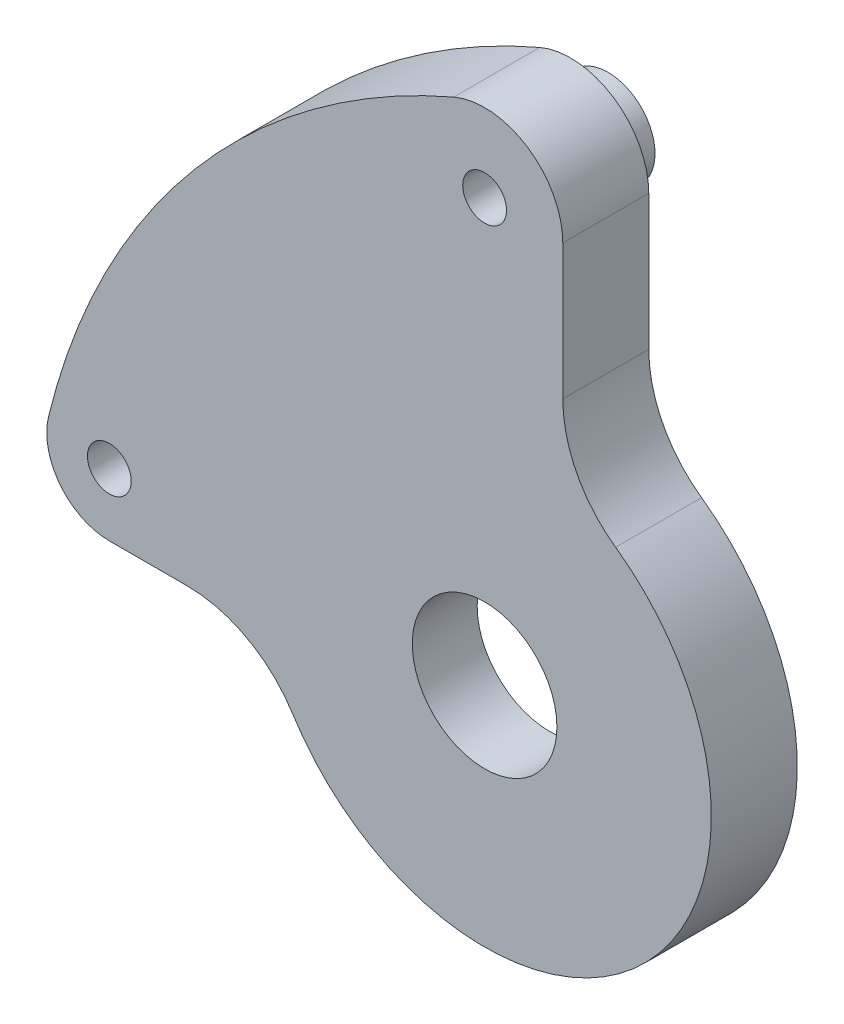
ISO-10303-21;
HEADER;
FILE_DESCRIPTION(('STEP AP214'),'2;1');
FILE_NAME('part.step','',(''),(''),'','','');
FILE_SCHEMA(('AUTOMOTIVE_DESIGN { 1 0 10303 214 1 1 1 1 }'));
ENDSEC;
DATA;
#1=APPLICATION_CONTEXT('core data for automotive mechanical design processes');
#2=APPLICATION_PROTOCOL_DEFINITION('international standard','automotive_design',2000,#1);
#3=PRODUCT_CONTEXT('',#1,'mechanical');
#4=PRODUCT('Part','Part','',(#3));
#5=PRODUCT_RELATED_PRODUCT_CATEGORY('part','',(#4));
#6=PRODUCT_DEFINITION_FORMATION('','',#4);
#7=PRODUCT_DEFINITION_CONTEXT('part definition',#1,'design');
#8=PRODUCT_DEFINITION('design','',#6,#7);
#9=PRODUCT_DEFINITION_SHAPE('','',#8);
#10=(LENGTH_UNIT() NAMED_UNIT(*) SI_UNIT(.MILLI.,.METRE.));
#11=(NAMED_UNIT(*) PLANE_ANGLE_UNIT() SI_UNIT($,.RADIAN.));
#12=(NAMED_UNIT(*) SI_UNIT($,.STERADIAN.) SOLID_ANGLE_UNIT());
#13=UNCERTAINTY_MEASURE_WITH_UNIT(LENGTH_MEASURE(1.E-05),#10,'distance_accuracy_value','');
#14=(GEOMETRIC_REPRESENTATION_CONTEXT(3) GLOBAL_UNCERTAINTY_ASSIGNED_CONTEXT((#13)) GLOBAL_UNIT_ASSIGNED_CONTEXT((#10,
#11,#12)) REPRESENTATION_CONTEXT('',''));
#15=CARTESIAN_POINT('',(0.,0.,0.));
#16=DIRECTION('',(0.,0.,1.));
#17=DIRECTION('',(1.,0.,0.));
#18=AXIS2_PLACEMENT_3D('',#15,#16,#17);
#19=CARTESIAN_POINT('',(0.,0.,-2.55));
#20=DIRECTION('',(0.,0.,1.));
#21=DIRECTION('',(-1.,0.,0.));
#22=AXIS2_PLACEMENT_3D('',#19,#20,#21);
#23=PLANE('',#22);
#24=CARTESIAN_POINT('',(0.,0.,-2.55));
#25=DIRECTION('',(0.,0.,1.));
#26=DIRECTION('',(-1.,0.,0.));
#27=AXIS2_PLACEMENT_3D('',#24,#25,#26);
#28=CIRCLE('',#27,12.2);
#29=CARTESIAN_POINT('',(-12.2,0.,-2.55));
#30=VERTEX_POINT('',#29);
#31=EDGE_CURVE('E195',#30,#30,#28,.T.);
#32=ORIENTED_EDGE('',*,*,#31,.F.);
#33=EDGE_LOOP('',(#32));
#34=FACE_BOUND('',#33,.T.);
#35=CARTESIAN_POINT('',(0.,0.,-2.55));
#36=DIRECTION('',(0.,0.,-1.));
#37=DIRECTION('',(-1.,0.,0.));
#38=AXIS2_PLACEMENT_3D('',#35,#36,#37);
#39=CIRCLE('',#38,6.375);
#40=CARTESIAN_POINT('',(-6.375,0.,-2.55));
#41=VERTEX_POINT('',#40);
#42=EDGE_CURVE('E11',#41,#41,#39,.F.);
#43=ORIENTED_EDGE('',*,*,#42,.T.);
#44=EDGE_LOOP('',(#43));
#45=FACE_BOUND('',#44,.T.);
#46=ADVANCED_FACE('F35',(#34,#45),#23,.F.);
#47=CARTESIAN_POINT('',(0.,0.,-5.5));
#48=DIRECTION('',(0.,0.,-1.));
#49=DIRECTION('',(1.,0.,0.));
#50=AXIS2_PLACEMENT_3D('',#47,#48,#49);
#51=PLANE('',#50);
#52=CARTESIAN_POINT('',(0.,0.,-5.5));
#53=DIRECTION('',(0.,0.,1.));
#54=DIRECTION('',(1.,0.,0.));
#55=AXIS2_PLACEMENT_3D('',#52,#53,#54);
#56=CIRCLE('',#55,14.5);
#57=CARTESIAN_POINT('',(-12.2656249557679,-7.73333333333334,-5.5));
#58=VERTEX_POINT('',#57);
#59=CARTESIAN_POINT('',(8.3777777777777,11.834814722089,-5.5));
#60=VERTEX_POINT('',#59);
#61=EDGE_CURVE('E143',#58,#60,#56,.T.);
#62=ORIENTED_EDGE('',*,*,#61,.F.);
#63=CARTESIAN_POINT('',(-19.0328663106743,-12.,-5.5));
#64=DIRECTION('',(0.,0.,-1.));
#65=DIRECTION('',(-1.,0.,0.));
#66=AXIS2_PLACEMENT_3D('',#63,#64,#65);
#67=CIRCLE('',#66,8.00000000000001);
#68=CARTESIAN_POINT('',(-19.0328663106743,-4.,-5.5));
#69=VERTEX_POINT('',#68);
#70=EDGE_CURVE('E161',#69,#58,#67,.T.);
#71=ORIENTED_EDGE('',*,*,#70,.F.);
#72=DIRECTION('',(1.,0.,0.));
#73=VECTOR('',#72,1.);
#74=CARTESIAN_POINT('',(-24.,-4.,-5.5));
#75=LINE('',#74,#73);
#76=CARTESIAN_POINT('',(-24.,-4.,-5.5));
#77=VERTEX_POINT('',#76);
#78=EDGE_CURVE('E159',#77,#69,#75,.T.);
#79=ORIENTED_EDGE('',*,*,#78,.F.);
#80=CARTESIAN_POINT('',(-24.,0.,-5.5));
#81=DIRECTION('',(0.,0.,1.));
#82=DIRECTION('',(1.,0.,0.));
#83=AXIS2_PLACEMENT_3D('',#80,#81,#82);
#84=CIRCLE('',#83,4.);
#85=CARTESIAN_POINT('',(-27.885598891218,0.949800640432248,-5.5));
#86=VERTEX_POINT('',#85);
#87=EDGE_CURVE('E130',#86,#77,#84,.T.);
#88=ORIENTED_EDGE('',*,*,#87,.F.);
#89=CARTESIAN_POINT('',(15.8273886349844,-9.73545656443054,-5.5));
#90=DIRECTION('',(0.,0.,1.));
#91=DIRECTION('',(1.,0.,0.));
#92=AXIS2_PLACEMENT_3D('',#89,#90,#91);
#93=CIRCLE('',#92,45.);
#94=CARTESIAN_POINT('',(-1.97842357937317,31.5919320705538,-5.5));
#95=VERTEX_POINT('',#94);
#96=EDGE_CURVE('E155',#95,#86,#93,.T.);
#97=ORIENTED_EDGE('',*,*,#96,.F.);
#98=CARTESIAN_POINT('',(-1.0088308886416E-13,27.,-5.5));
#99=DIRECTION('',(0.,0.,1.));
#100=DIRECTION('',(1.,0.,0.));
#101=AXIS2_PLACEMENT_3D('',#98,#99,#100);
#102=CIRCLE('',#101,4.99999999999999);
#103=CARTESIAN_POINT('',(4.9999999999999,27.,-5.5));
#104=VERTEX_POINT('',#103);
#105=EDGE_CURVE('E152',#104,#95,#102,.T.);
#106=ORIENTED_EDGE('',*,*,#105,.F.);
#107=DIRECTION('',(0.,1.,0.));
#108=VECTOR('',#107,1.);
#109=CARTESIAN_POINT('',(4.9999999999999,18.364367672207,-5.5));
#110=LINE('',#109,#108);
#111=CARTESIAN_POINT('',(4.99999999999991,18.364367672207,-5.5));
#112=VERTEX_POINT('',#111);
#113=EDGE_CURVE('E149',#112,#104,#110,.T.);
#114=ORIENTED_EDGE('',*,*,#113,.F.);
#115=CARTESIAN_POINT('',(13.,18.364367672207,-5.5));
#116=DIRECTION('',(0.,0.,-1.));
#117=DIRECTION('',(-1.,0.,0.));
#118=AXIS2_PLACEMENT_3D('',#115,#116,#117);
#119=CIRCLE('',#118,8.00000000000009);
#120=EDGE_CURVE('E145',#60,#112,#119,.T.);
#121=ORIENTED_EDGE('',*,*,#120,.F.);
#122=EDGE_LOOP('',(#62,#71,#79,#88,#97,#106,#114,#121));
#123=FACE_BOUND('',#122,.T.);
#124=CARTESIAN_POINT('',(-1.00613961606655E-13,27.,-5.5));
#125=DIRECTION('',(0.,0.,1.));
#126=DIRECTION('',(1.,0.,0.));
#127=AXIS2_PLACEMENT_3D('',#124,#125,#126);
#128=CIRCLE('',#127,3.);
#129=CARTESIAN_POINT('',(2.9999999999999,27.,-5.5));
#130=VERTEX_POINT('',#129);
#131=EDGE_CURVE('E200',#130,#130,#128,.T.);
#132=ORIENTED_EDGE('',*,*,#131,.T.);
#133=EDGE_LOOP('',(#132));
#134=FACE_BOUND('',#133,.T.);
#135=CARTESIAN_POINT('',(-24.,0.,-5.5));
#136=DIRECTION('',(0.,0.,1.));
#137=DIRECTION('',(1.,0.,0.));
#138=AXIS2_PLACEMENT_3D('',#135,#136,#137);
#139=CIRCLE('',#138,3.);
#140=CARTESIAN_POINT('',(-21.,0.,-5.5));
#141=VERTEX_POINT('',#140);
#142=EDGE_CURVE('E180',#141,#141,#139,.T.);
#143=ORIENTED_EDGE('',*,*,#142,.T.);
#144=EDGE_LOOP('',(#143));
#145=FACE_BOUND('',#144,.T.);
#146=CARTESIAN_POINT('',(0.,0.,-5.5));
#147=DIRECTION('',(0.,0.,1.));
#148=DIRECTION('',(-1.,0.,0.));
#149=AXIS2_PLACEMENT_3D('',#146,#147,#148);
#150=CIRCLE('',#149,12.2);
#151=CARTESIAN_POINT('',(-12.2,0.,-5.5));
#152=VERTEX_POINT('',#151);
#153=EDGE_CURVE('E191',#152,#152,#150,.T.);
#154=ORIENTED_EDGE('',*,*,#153,.T.);
#155=EDGE_LOOP('',(#154));
#156=FACE_BOUND('',#155,.T.);
#157=CARTESIAN_POINT('',(0.499999999999904,19.6403211148632,-5.5));
#158=DIRECTION('',(0.,0.,1.));
#159=DIRECTION('',(1.,0.,0.));
#160=AXIS2_PLACEMENT_3D('',#157,#158,#159);
#161=CIRCLE('',#160,1.99999999999999);
#162=CARTESIAN_POINT('',(2.4999999999999,19.6403211148632,-5.5));
#163=VERTEX_POINT('',#162);
#164=CARTESIAN_POINT('',(0.364436994473665,21.6357214936175,-5.5));
#165=VERTEX_POINT('',#164);
#166=EDGE_CURVE('E504',#163,#165,#161,.T.);
#167=ORIENTED_EDGE('',*,*,#166,.T.);
#168=CARTESIAN_POINT('',(-1.0088308886416E-13,27.,-5.5));
#169=DIRECTION('',(0.,0.,-1.));
#170=DIRECTION('',(-1.,0.,0.));
#171=AXIS2_PLACEMENT_3D('',#168,#169,#170);
#172=CIRCLE('',#171,5.37664376883742);
#173=CARTESIAN_POINT('',(-4.88534881497165,24.7546347350521,-5.5));
#174=VERTEX_POINT('',#173);
#175=EDGE_CURVE('E507',#165,#174,#172,.T.);
#176=ORIENTED_EDGE('',*,*,#175,.T.);
#177=CARTESIAN_POINT('',(-6.70259727888763,23.9194054130123,-5.5));
#178=DIRECTION('',(0.,0.,1.));
#179=DIRECTION('',(1.,0.,0.));
#180=AXIS2_PLACEMENT_3D('',#177,#178,#179);
#181=CIRCLE('',#180,2.00000000000001);
#182=CARTESIAN_POINT('',(-7.81518917586899,25.5813739057255,-5.5));
#183=VERTEX_POINT('',#182);
#184=EDGE_CURVE('E545',#174,#183,#181,.T.);
#185=ORIENTED_EDGE('',*,*,#184,.T.);
#186=CARTESIAN_POINT('',(15.8273886349844,-9.73545656443054,-5.5));
#187=DIRECTION('',(0.,0.,1.));
#188=DIRECTION('',(1.,0.,0.));
#189=AXIS2_PLACEMENT_3D('',#186,#187,#188);
#190=CIRCLE('',#189,42.5);
#191=CARTESIAN_POINT('',(-22.9685647486348,7.6174682915136,-5.5));
#192=VERTEX_POINT('',#191);
#193=EDGE_CURVE('E548',#183,#192,#190,.T.);
#194=ORIENTED_EDGE('',*,*,#193,.T.);
#195=CARTESIAN_POINT('',(-21.1428728246998,6.80086006299858,-5.5));
#196=DIRECTION('',(0.,0.,1.));
#197=DIRECTION('',(1.,0.,0.));
#198=AXIS2_PLACEMENT_3D('',#195,#196,#197);
#199=CIRCLE('',#198,1.99999999999999);
#200=CARTESIAN_POINT('',(-21.9175143188085,4.95697000239168,-5.5));
#201=VERTEX_POINT('',#200);
#202=EDGE_CURVE('E551',#192,#201,#199,.T.);
#203=ORIENTED_EDGE('',*,*,#202,.T.);
#204=CARTESIAN_POINT('',(-24.,0.,-5.5));
#205=DIRECTION('',(0.,0.,-1.));
#206=DIRECTION('',(-1.,0.,0.));
#207=AXIS2_PLACEMENT_3D('',#204,#205,#206);
#208=CIRCLE('',#207,5.37664376883742);
#209=CARTESIAN_POINT('',(-20.6588009121664,4.21244428716133,-5.5));
#210=VERTEX_POINT('',#209);
#211=EDGE_CURVE('E554',#201,#210,#208,.T.);
#212=ORIENTED_EDGE('',*,*,#211,.T.);
#213=CARTESIAN_POINT('',(-19.4159441295769,5.77938621906922,-5.5));
#214=DIRECTION('',(0.,0.,1.));
#215=DIRECTION('',(1.,0.,0.));
#216=AXIS2_PLACEMENT_3D('',#213,#214,#215);
#217=CIRCLE('',#216,2.00000000000001);
#218=CARTESIAN_POINT('',(-17.638370064666,4.86274537132348,-5.5));
#219=VERTEX_POINT('',#218);
#220=EDGE_CURVE('E557',#210,#219,#217,.T.);
#221=ORIENTED_EDGE('',*,*,#220,.T.);
#222=CARTESIAN_POINT('',(-0.904677725958615,-3.76631050547785,-5.5));
#223=DIRECTION('',(0.,0.,-1.));
#224=DIRECTION('',(-1.,0.,0.));
#225=AXIS2_PLACEMENT_3D('',#222,#223,#224);
#226=CIRCLE('',#225,18.8275613028207);
#227=CARTESIAN_POINT('',(0.431762956453784,15.0137584750628,-5.5));
#228=VERTEX_POINT('',#227);
#229=EDGE_CURVE('E560',#219,#228,#226,.T.);
#230=ORIENTED_EDGE('',*,*,#229,.T.);
#231=CARTESIAN_POINT('',(0.573729370575846,17.0087134964257,-5.5));
#232=DIRECTION('',(0.,0.,1.));
#233=DIRECTION('',(1.,0.,0.));
#234=AXIS2_PLACEMENT_3D('',#231,#232,#233);
#235=CIRCLE('',#234,1.99999999999999);
#236=CARTESIAN_POINT('',(2.56193267128369,17.2256181645507,-5.5));
#237=VERTEX_POINT('',#236);
#238=EDGE_CURVE('E563',#228,#237,#235,.T.);
#239=ORIENTED_EDGE('',*,*,#238,.T.);
#240=CARTESIAN_POINT('',(13.,18.364367672207,-5.5));
#241=DIRECTION('',(0.,0.,-1.));
#242=DIRECTION('',(-1.,0.,0.));
#243=AXIS2_PLACEMENT_3D('',#240,#241,#242);
#244=CIRCLE('',#243,10.5000000000001);
#245=CARTESIAN_POINT('',(2.4999999999999,18.364367672207,-5.5));
#246=VERTEX_POINT('',#245);
#247=EDGE_CURVE('E566',#237,#246,#244,.T.);
#248=ORIENTED_EDGE('',*,*,#247,.T.);
#249=DIRECTION('',(0.,1.,0.));
#250=VECTOR('',#249,1.);
#251=CARTESIAN_POINT('',(2.4999999999999,18.364367672207,-5.5));
#252=LINE('',#251,#250);
#253=EDGE_CURVE('E513',#246,#163,#252,.T.);
#254=ORIENTED_EDGE('',*,*,#253,.T.);
#255=EDGE_LOOP('',(#167,#176,#185,#194,#203,#212,#221,#230,#239,#248,#254));
#256=FACE_BOUND('',#255,.T.);
#257=ADVANCED_FACE('F224',(#123,#134,#145,#156,#256),#51,.T.);
#258=CARTESIAN_POINT('',(0.,0.,0.));
#259=DIRECTION('',(0.,0.,-1.));
#260=DIRECTION('',(1.,0.,0.));
#261=AXIS2_PLACEMENT_3D('',#258,#259,#260);
#262=CYLINDRICAL_SURFACE('',#261,14.5);
#263=ORIENTED_EDGE('',*,*,#61,.T.);
#264=DIRECTION('',(0.,0.,-1.));
#265=VECTOR('',#264,1.);
#266=CARTESIAN_POINT('',(8.3777777777777,11.834814722089,0.));
#267=LINE('',#266,#265);
#268=CARTESIAN_POINT('',(8.3777777777777,11.834814722089,0.));
#269=VERTEX_POINT('',#268);
#270=EDGE_CURVE('E139',#269,#60,#267,.T.);
#271=ORIENTED_EDGE('',*,*,#270,.F.);
#272=CARTESIAN_POINT('',(0.,0.,0.));
#273=DIRECTION('',(0.,0.,1.));
#274=DIRECTION('',(1.,0.,0.));
#275=AXIS2_PLACEMENT_3D('',#272,#273,#274);
#276=CIRCLE('',#275,14.5);
#277=CARTESIAN_POINT('',(-12.2656249557679,-7.73333333333334,0.));
#278=VERTEX_POINT('',#277);
#279=EDGE_CURVE('E163',#278,#269,#276,.T.);
#280=ORIENTED_EDGE('',*,*,#279,.F.);
#281=DIRECTION('',(0.,0.,-1.));
#282=VECTOR('',#281,1.);
#283=CARTESIAN_POINT('',(-12.2656249557679,-7.73333333333334,0.));
#284=LINE('',#283,#282);
#285=EDGE_CURVE('E43',#278,#58,#284,.T.);
#286=ORIENTED_EDGE('',*,*,#285,.T.);
#287=EDGE_LOOP('',(#263,#271,#280,#286));
#288=FACE_BOUND('',#287,.T.);
#289=ADVANCED_FACE('F231',(#288),#262,.T.);
#290=CARTESIAN_POINT('',(-19.0328663106743,-12.,0.));
#291=DIRECTION('',(0.,0.,-1.));
#292=DIRECTION('',(1.,0.,0.));
#293=AXIS2_PLACEMENT_3D('',#290,#291,#292);
#294=CYLINDRICAL_SURFACE('',#293,8.00000000000001);
#295=ORIENTED_EDGE('',*,*,#70,.T.);
#296=ORIENTED_EDGE('',*,*,#285,.F.);
#297=CARTESIAN_POINT('',(-19.0328663106743,-12.,0.));
#298=DIRECTION('',(0.,0.,-1.));
#299=DIRECTION('',(-1.,0.,0.));
#300=AXIS2_PLACEMENT_3D('',#297,#298,#299);
#301=CIRCLE('',#300,8.00000000000001);
#302=CARTESIAN_POINT('',(-19.0328663106743,-4.,0.));
#303=VERTEX_POINT('',#302);
#304=EDGE_CURVE('E59',#303,#278,#301,.T.);
#305=ORIENTED_EDGE('',*,*,#304,.F.);
#306=DIRECTION('',(0.,0.,-1.));
#307=VECTOR('',#306,1.);
#308=CARTESIAN_POINT('',(-19.0328663106743,-4.,0.));
#309=LINE('',#308,#307);
#310=EDGE_CURVE('E134',#303,#69,#309,.T.);
#311=ORIENTED_EDGE('',*,*,#310,.T.);
#312=EDGE_LOOP('',(#295,#296,#305,#311));
#313=FACE_BOUND('',#312,.T.);
#314=ADVANCED_FACE('F229',(#313),#294,.F.);
#315=CARTESIAN_POINT('',(-24.,-4.,0.));
#316=DIRECTION('',(0.,-1.,0.));
#317=DIRECTION('',(0.,0.,1.));
#318=AXIS2_PLACEMENT_3D('',#315,#316,#317);
#319=PLANE('',#318);
#320=ORIENTED_EDGE('',*,*,#78,.T.);
#321=ORIENTED_EDGE('',*,*,#310,.F.);
#322=DIRECTION('',(1.,0.,0.));
#323=VECTOR('',#322,1.);
#324=CARTESIAN_POINT('',(-24.,-4.,0.));
#325=LINE('',#324,#323);
#326=CARTESIAN_POINT('',(-24.,-4.,0.));
#327=VERTEX_POINT('',#326);
#328=EDGE_CURVE('E119',#327,#303,#325,.T.);
#329=ORIENTED_EDGE('',*,*,#328,.F.);
#330=DIRECTION('',(0.,0.,-1.));
#331=VECTOR('',#330,1.);
#332=CARTESIAN_POINT('',(-24.,-4.,0.));
#333=LINE('',#332,#331);
#334=EDGE_CURVE('E127',#327,#77,#333,.T.);
#335=ORIENTED_EDGE('',*,*,#334,.T.);
#336=EDGE_LOOP('',(#320,#321,#329,#335));
#337=FACE_BOUND('',#336,.T.);
#338=ADVANCED_FACE('F137',(#337),#319,.T.);
#339=CARTESIAN_POINT('',(-24.,0.,0.));
#340=DIRECTION('',(0.,0.,-1.));
#341=DIRECTION('',(1.,0.,0.));
#342=AXIS2_PLACEMENT_3D('',#339,#340,#341);
#343=CYLINDRICAL_SURFACE('',#342,4.);
#344=ORIENTED_EDGE('',*,*,#87,.T.);
#345=ORIENTED_EDGE('',*,*,#334,.F.);
#346=CARTESIAN_POINT('',(-24.,0.,0.));
#347=DIRECTION('',(0.,0.,1.));
#348=DIRECTION('',(1.,0.,0.));
#349=AXIS2_PLACEMENT_3D('',#346,#347,#348);
#350=CIRCLE('',#349,4.);
#351=CARTESIAN_POINT('',(-27.885598891218,0.949800640432248,0.));
#352=VERTEX_POINT('',#351);
#353=EDGE_CURVE('E115',#352,#327,#350,.T.);
#354=ORIENTED_EDGE('',*,*,#353,.F.);
#355=DIRECTION('',(0.,0.,-1.));
#356=VECTOR('',#355,1.);
#357=CARTESIAN_POINT('',(-27.885598891218,0.949800640432248,0.));
#358=LINE('',#357,#356);
#359=EDGE_CURVE('E135',#352,#86,#358,.T.);
#360=ORIENTED_EDGE('',*,*,#359,.T.);
#361=EDGE_LOOP('',(#344,#345,#354,#360));
#362=FACE_BOUND('',#361,.T.);
#363=ADVANCED_FACE('F128',(#362),#343,.T.);
#364=CARTESIAN_POINT('',(15.8273886349844,-9.73545656443054,0.));
#365=DIRECTION('',(0.,0.,-1.));
#366=DIRECTION('',(1.,0.,0.));
#367=AXIS2_PLACEMENT_3D('',#364,#365,#366);
#368=CYLINDRICAL_SURFACE('',#367,45.);
#369=ORIENTED_EDGE('',*,*,#96,.T.);
#370=ORIENTED_EDGE('',*,*,#359,.F.);
#371=CARTESIAN_POINT('',(15.8273886349844,-9.73545656443054,0.));
#372=DIRECTION('',(0.,0.,1.));
#373=DIRECTION('',(1.,0.,0.));
#374=AXIS2_PLACEMENT_3D('',#371,#372,#373);
#375=CIRCLE('',#374,45.);
#376=CARTESIAN_POINT('',(-1.97842357937317,31.5919320705538,0.));
#377=VERTEX_POINT('',#376);
#378=EDGE_CURVE('E122',#377,#352,#375,.T.);
#379=ORIENTED_EDGE('',*,*,#378,.F.);
#380=DIRECTION('',(0.,0.,-1.));
#381=VECTOR('',#380,1.);
#382=CARTESIAN_POINT('',(-1.97842357937317,31.5919320705538,0.));
#383=LINE('',#382,#381);
#384=EDGE_CURVE('E167',#377,#95,#383,.T.);
#385=ORIENTED_EDGE('',*,*,#384,.T.);
#386=EDGE_LOOP('',(#369,#370,#379,#385));
#387=FACE_BOUND('',#386,.T.);
#388=ADVANCED_FACE('F221',(#387),#368,.T.);
#389=CARTESIAN_POINT('',(-1.0088308886416E-13,27.,0.));
#390=DIRECTION('',(0.,0.,-1.));
#391=DIRECTION('',(1.,0.,0.));
#392=AXIS2_PLACEMENT_3D('',#389,#390,#391);
#393=CYLINDRICAL_SURFACE('',#392,4.99999999999999);
#394=ORIENTED_EDGE('',*,*,#105,.T.);
#395=ORIENTED_EDGE('',*,*,#384,.F.);
#396=CARTESIAN_POINT('',(-1.0088308886416E-13,27.,0.));
#397=DIRECTION('',(0.,0.,1.));
#398=DIRECTION('',(1.,0.,0.));
#399=AXIS2_PLACEMENT_3D('',#396,#397,#398);
#400=CIRCLE('',#399,4.99999999999999);
#401=CARTESIAN_POINT('',(4.9999999999999,27.,0.));
#402=VERTEX_POINT('',#401);
#403=EDGE_CURVE('E211',#402,#377,#400,.T.);
#404=ORIENTED_EDGE('',*,*,#403,.F.);
#405=DIRECTION('',(0.,0.,-1.));
#406=VECTOR('',#405,1.);
#407=CARTESIAN_POINT('',(4.9999999999999,27.,0.));
#408=LINE('',#407,#406);
#409=EDGE_CURVE('E169',#402,#104,#408,.T.);
#410=ORIENTED_EDGE('',*,*,#409,.T.);
#411=EDGE_LOOP('',(#394,#395,#404,#410));
#412=FACE_BOUND('',#411,.T.);
#413=ADVANCED_FACE('F217',(#412),#393,.T.);
#414=CARTESIAN_POINT('',(4.9999999999999,18.364367672207,0.));
#415=DIRECTION('',(1.,0.,0.));
#416=DIRECTION('',(0.,0.,1.));
#417=AXIS2_PLACEMENT_3D('',#414,#415,#416);
#418=PLANE('',#417);
#419=ORIENTED_EDGE('',*,*,#113,.T.);
#420=ORIENTED_EDGE('',*,*,#409,.F.);
#421=DIRECTION('',(0.,1.,0.));
#422=VECTOR('',#421,1.);
#423=CARTESIAN_POINT('',(4.9999999999999,18.364367672207,0.));
#424=LINE('',#423,#422);
#425=CARTESIAN_POINT('',(4.99999999999991,18.364367672207,0.));
#426=VERTEX_POINT('',#425);
#427=EDGE_CURVE('E209',#426,#402,#424,.T.);
#428=ORIENTED_EDGE('',*,*,#427,.F.);
#429=DIRECTION('',(0.,0.,-1.));
#430=VECTOR('',#429,1.);
#431=CARTESIAN_POINT('',(4.99999999999991,18.364367672207,0.));
#432=LINE('',#431,#430);
#433=EDGE_CURVE('E171',#426,#112,#432,.T.);
#434=ORIENTED_EDGE('',*,*,#433,.T.);
#435=EDGE_LOOP('',(#419,#420,#428,#434));
#436=FACE_BOUND('',#435,.T.);
#437=ADVANCED_FACE('F235',(#436),#418,.T.);
#438=CARTESIAN_POINT('',(13.,18.364367672207,0.));
#439=DIRECTION('',(0.,0.,-1.));
#440=DIRECTION('',(1.,0.,0.));
#441=AXIS2_PLACEMENT_3D('',#438,#439,#440);
#442=CYLINDRICAL_SURFACE('',#441,8.00000000000009);
#443=ORIENTED_EDGE('',*,*,#120,.T.);
#444=ORIENTED_EDGE('',*,*,#433,.F.);
#445=CARTESIAN_POINT('',(13.,18.364367672207,0.));
#446=DIRECTION('',(0.,0.,-1.));
#447=DIRECTION('',(-1.,0.,0.));
#448=AXIS2_PLACEMENT_3D('',#445,#446,#447);
#449=CIRCLE('',#448,8.00000000000009);
#450=EDGE_CURVE('E99',#269,#426,#449,.T.);
#451=ORIENTED_EDGE('',*,*,#450,.F.);
#452=ORIENTED_EDGE('',*,*,#270,.T.);
#453=EDGE_LOOP('',(#443,#444,#451,#452));
#454=FACE_BOUND('',#453,.T.);
#455=ADVANCED_FACE('F232',(#454),#442,.F.);
#456=CARTESIAN_POINT('',(0.,0.,0.));
#457=DIRECTION('',(0.,0.,-1.));
#458=DIRECTION('',(1.,0.,0.));
#459=AXIS2_PLACEMENT_3D('',#456,#457,#458);
#460=PLANE('',#459);
#461=CARTESIAN_POINT('',(-1.01047642475649E-13,27.,0.));
#462=DIRECTION('',(0.,0.,1.));
#463=DIRECTION('',(-1.,0.,0.));
#464=AXIS2_PLACEMENT_3D('',#461,#462,#463);
#465=CIRCLE('',#464,1.4);
#466=CARTESIAN_POINT('',(-1.4000000000001,27.,0.));
#467=VERTEX_POINT('',#466);
#468=EDGE_CURVE('E176',#467,#467,#465,.T.);
#469=ORIENTED_EDGE('',*,*,#468,.F.);
#470=EDGE_LOOP('',(#469));
#471=FACE_BOUND('',#470,.T.);
#472=CARTESIAN_POINT('',(-24.,0.,0.));
#473=DIRECTION('',(0.,0.,1.));
#474=DIRECTION('',(-1.,0.,0.));
#475=AXIS2_PLACEMENT_3D('',#472,#473,#474);
#476=CIRCLE('',#475,1.4);
#477=CARTESIAN_POINT('',(-25.4,0.,0.));
#478=VERTEX_POINT('',#477);
#479=EDGE_CURVE('E188',#478,#478,#476,.T.);
#480=ORIENTED_EDGE('',*,*,#479,.F.);
#481=EDGE_LOOP('',(#480));
#482=FACE_BOUND('',#481,.T.);
#483=CARTESIAN_POINT('',(0.,0.,0.));
#484=DIRECTION('',(0.,0.,-1.));
#485=DIRECTION('',(1.,0.,0.));
#486=AXIS2_PLACEMENT_3D('',#483,#484,#485);
#487=CIRCLE('',#486,4.625);
#488=CARTESIAN_POINT('',(4.625,0.,0.));
#489=VERTEX_POINT('',#488);
#490=EDGE_CURVE('E175',#489,#489,#487,.T.);
#491=ORIENTED_EDGE('',*,*,#490,.T.);
#492=EDGE_LOOP('',(#491));
#493=FACE_BOUND('',#492,.T.);
#494=ORIENTED_EDGE('',*,*,#279,.T.);
#495=ORIENTED_EDGE('',*,*,#450,.T.);
#496=ORIENTED_EDGE('',*,*,#427,.T.);
#497=ORIENTED_EDGE('',*,*,#403,.T.);
#498=ORIENTED_EDGE('',*,*,#378,.T.);
#499=ORIENTED_EDGE('',*,*,#353,.T.);
#500=ORIENTED_EDGE('',*,*,#328,.T.);
#501=ORIENTED_EDGE('',*,*,#304,.T.);
#502=EDGE_LOOP('',(#494,#495,#496,#497,#498,#499,#500,#501));
#503=FACE_BOUND('',#502,.T.);
#504=ADVANCED_FACE('F117',(#471,#482,#493,#503),#460,.F.);
#505=CARTESIAN_POINT('',(-1.00613961606655E-13,27.,-7.9));
#506=DIRECTION('',(0.,0.,1.));
#507=DIRECTION('',(-1.,0.,0.));
#508=AXIS2_PLACEMENT_3D('',#505,#506,#507);
#509=CYLINDRICAL_SURFACE('',#508,3.);
#510=CARTESIAN_POINT('',(-1.00613961606655E-13,27.,-7.9));
#511=DIRECTION('',(0.,0.,1.));
#512=DIRECTION('',(1.,0.,0.));
#513=AXIS2_PLACEMENT_3D('',#510,#511,#512);
#514=CIRCLE('',#513,3.);
#515=CARTESIAN_POINT('',(2.9999999999999,27.,-7.9));
#516=VERTEX_POINT('',#515);
#517=EDGE_CURVE('E146',#516,#516,#514,.T.);
#518=ORIENTED_EDGE('',*,*,#517,.T.);
#519=EDGE_LOOP('',(#518));
#520=FACE_BOUND('',#519,.T.);
#521=ORIENTED_EDGE('',*,*,#131,.F.);
#522=EDGE_LOOP('',(#521));
#523=FACE_BOUND('',#522,.T.);
#524=ADVANCED_FACE('F282',(#520,#523),#509,.T.);
#525=CARTESIAN_POINT('',(-1.00613961606655E-13,27.,-7.9));
#526=DIRECTION('',(0.,0.,-1.));
#527=DIRECTION('',(1.,0.,0.));
#528=AXIS2_PLACEMENT_3D('',#525,#526,#527);
#529=PLANE('',#528);
#530=CARTESIAN_POINT('',(-1.01047642475649E-13,27.,-7.9));
#531=DIRECTION('',(0.,0.,1.));
#532=DIRECTION('',(-1.,0.,0.));
#533=AXIS2_PLACEMENT_3D('',#530,#531,#532);
#534=CIRCLE('',#533,1.4);
#535=CARTESIAN_POINT('',(-1.4000000000001,27.,-7.9));
#536=VERTEX_POINT('',#535);
#537=EDGE_CURVE('E183',#536,#536,#534,.T.);
#538=ORIENTED_EDGE('',*,*,#537,.T.);
#539=EDGE_LOOP('',(#538));
#540=FACE_BOUND('',#539,.T.);
#541=ORIENTED_EDGE('',*,*,#517,.F.);
#542=EDGE_LOOP('',(#541));
#543=FACE_BOUND('',#542,.T.);
#544=ADVANCED_FACE('F278',(#540,#543),#529,.T.);
#545=CARTESIAN_POINT('',(-24.,0.,-6.5));
#546=DIRECTION('',(0.,0.,1.));
#547=DIRECTION('',(-1.,0.,0.));
#548=AXIS2_PLACEMENT_3D('',#545,#546,#547);
#549=CYLINDRICAL_SURFACE('',#548,3.);
#550=CARTESIAN_POINT('',(-24.,0.,-6.5));
#551=DIRECTION('',(0.,0.,1.));
#552=DIRECTION('',(1.,0.,0.));
#553=AXIS2_PLACEMENT_3D('',#550,#551,#552);
#554=CIRCLE('',#553,3.);
#555=CARTESIAN_POINT('',(-21.,0.,-6.5));
#556=VERTEX_POINT('',#555);
#557=EDGE_CURVE('E197',#556,#556,#554,.T.);
#558=ORIENTED_EDGE('',*,*,#557,.T.);
#559=EDGE_LOOP('',(#558));
#560=FACE_BOUND('',#559,.T.);
#561=ORIENTED_EDGE('',*,*,#142,.F.);
#562=EDGE_LOOP('',(#561));
#563=FACE_BOUND('',#562,.T.);
#564=ADVANCED_FACE('F275',(#560,#563),#549,.T.);
#565=CARTESIAN_POINT('',(-24.,0.,-6.5));
#566=DIRECTION('',(0.,0.,-1.));
#567=DIRECTION('',(1.,0.,0.));
#568=AXIS2_PLACEMENT_3D('',#565,#566,#567);
#569=PLANE('',#568);
#570=CARTESIAN_POINT('',(-24.,0.,-6.5));
#571=DIRECTION('',(0.,0.,1.));
#572=DIRECTION('',(1.,0.,0.));
#573=AXIS2_PLACEMENT_3D('',#570,#571,#572);
#574=CIRCLE('',#573,1.4);
#575=CARTESIAN_POINT('',(-22.6,0.,-6.5));
#576=VERTEX_POINT('',#575);
#577=EDGE_CURVE('E173',#576,#576,#574,.T.);
#578=ORIENTED_EDGE('',*,*,#577,.T.);
#579=EDGE_LOOP('',(#578));
#580=FACE_BOUND('',#579,.T.);
#581=ORIENTED_EDGE('',*,*,#557,.F.);
#582=EDGE_LOOP('',(#581));
#583=FACE_BOUND('',#582,.T.);
#584=ADVANCED_FACE('F271',(#580,#583),#569,.T.);
#585=CARTESIAN_POINT('',(0.,0.,-7.9));
#586=DIRECTION('',(0.,0.,1.));
#587=DIRECTION('',(-1.,0.,0.));
#588=AXIS2_PLACEMENT_3D('',#585,#586,#587);
#589=CYLINDRICAL_SURFACE('',#588,4.625);
#590=ORIENTED_EDGE('',*,*,#490,.F.);
#591=EDGE_LOOP('',(#590));
#592=FACE_BOUND('',#591,.T.);
#593=CARTESIAN_POINT('',(0.,0.,-4.15));
#594=DIRECTION('',(0.,0.,1.));
#595=DIRECTION('',(1.,0.,0.));
#596=AXIS2_PLACEMENT_3D('',#593,#594,#595);
#597=CIRCLE('',#596,4.625);
#598=CARTESIAN_POINT('',(4.625,0.,-4.15));
#599=VERTEX_POINT('',#598);
#600=EDGE_CURVE('E502',#599,#599,#597,.T.);
#601=ORIENTED_EDGE('',*,*,#600,.F.);
#602=EDGE_LOOP('',(#601));
#603=FACE_BOUND('',#602,.T.);
#604=ADVANCED_FACE('F267',(#592,#603),#589,.F.);
#605=CARTESIAN_POINT('',(-24.,0.,0.));
#606=DIRECTION('',(0.,0.,-1.));
#607=DIRECTION('',(1.,0.,0.));
#608=AXIS2_PLACEMENT_3D('',#605,#606,#607);
#609=CYLINDRICAL_SURFACE('',#608,1.4);
#610=ORIENTED_EDGE('',*,*,#577,.F.);
#611=EDGE_LOOP('',(#610));
#612=FACE_BOUND('',#611,.T.);
#613=ORIENTED_EDGE('',*,*,#479,.T.);
#614=EDGE_LOOP('',(#613));
#615=FACE_BOUND('',#614,.T.);
#616=ADVANCED_FACE('F264',(#612,#615),#609,.F.);
#617=CARTESIAN_POINT('',(-1.01047642475649E-13,27.,0.));
#618=DIRECTION('',(0.,0.,-1.));
#619=DIRECTION('',(1.,0.,0.));
#620=AXIS2_PLACEMENT_3D('',#617,#618,#619);
#621=CYLINDRICAL_SURFACE('',#620,1.4);
#622=ORIENTED_EDGE('',*,*,#468,.T.);
#623=EDGE_LOOP('',(#622));
#624=FACE_BOUND('',#623,.T.);
#625=ORIENTED_EDGE('',*,*,#537,.F.);
#626=EDGE_LOOP('',(#625));
#627=FACE_BOUND('',#626,.T.);
#628=ADVANCED_FACE('F260',(#624,#627),#621,.F.);
#629=CARTESIAN_POINT('',(0.,0.,-2.55));
#630=DIRECTION('',(0.,0.,-1.));
#631=DIRECTION('',(1.,0.,0.));
#632=AXIS2_PLACEMENT_3D('',#629,#630,#631);
#633=CYLINDRICAL_SURFACE('',#632,12.2);
#634=ORIENTED_EDGE('',*,*,#31,.T.);
#635=EDGE_LOOP('',(#634));
#636=FACE_BOUND('',#635,.T.);
#637=ORIENTED_EDGE('',*,*,#153,.F.);
#638=EDGE_LOOP('',(#637));
#639=FACE_BOUND('',#638,.T.);
#640=ADVANCED_FACE('F257',(#636,#639),#633,.F.);
#641=CARTESIAN_POINT('',(0.499999999999904,19.6403211148632,-2.));
#642=DIRECTION('',(0.,0.,-1.));
#643=DIRECTION('',(1.,0.,0.));
#644=AXIS2_PLACEMENT_3D('',#641,#642,#643);
#645=CYLINDRICAL_SURFACE('',#644,1.99999999999999);
#646=ORIENTED_EDGE('',*,*,#166,.F.);
#647=DIRECTION('',(0.,0.,-1.));
#648=VECTOR('',#647,1.);
#649=CARTESIAN_POINT('',(2.4999999999999,19.6403211148632,-2.));
#650=LINE('',#649,#648);
#651=CARTESIAN_POINT('',(2.4999999999999,19.6403211148632,-2.));
#652=VERTEX_POINT('',#651);
#653=EDGE_CURVE('E571',#652,#163,#650,.T.);
#654=ORIENTED_EDGE('',*,*,#653,.F.);
#655=CARTESIAN_POINT('',(0.499999999999904,19.6403211148632,-2.));
#656=DIRECTION('',(0.,0.,1.));
#657=DIRECTION('',(1.,0.,0.));
#658=AXIS2_PLACEMENT_3D('',#655,#656,#657);
#659=CIRCLE('',#658,1.99999999999999);
#660=CARTESIAN_POINT('',(0.364436994473665,21.6357214936175,-2.));
#661=VERTEX_POINT('',#660);
#662=EDGE_CURVE('E510',#652,#661,#659,.T.);
#663=ORIENTED_EDGE('',*,*,#662,.T.);
#664=DIRECTION('',(0.,0.,-1.));
#665=VECTOR('',#664,1.);
#666=CARTESIAN_POINT('',(0.364436994473665,21.6357214936175,-2.));
#667=LINE('',#666,#665);
#668=EDGE_CURVE('E50',#661,#165,#667,.T.);
#669=ORIENTED_EDGE('',*,*,#668,.T.);
#670=EDGE_LOOP('',(#646,#654,#663,#669));
#671=FACE_BOUND('',#670,.T.);
#672=ADVANCED_FACE('F255',(#671),#645,.F.);
#673=CARTESIAN_POINT('',(2.4999999999999,18.364367672207,-2.));
#674=DIRECTION('',(1.,0.,0.));
#675=DIRECTION('',(0.,1.,0.));
#676=AXIS2_PLACEMENT_3D('',#673,#674,#675);
#677=PLANE('',#676);
#678=ORIENTED_EDGE('',*,*,#253,.F.);
#679=DIRECTION('',(0.,0.,-1.));
#680=VECTOR('',#679,1.);
#681=CARTESIAN_POINT('',(2.4999999999999,18.364367672207,-2.));
#682=LINE('',#681,#680);
#683=CARTESIAN_POINT('',(2.4999999999999,18.364367672207,-2.));
#684=VERTEX_POINT('',#683);
#685=EDGE_CURVE('E574',#684,#246,#682,.T.);
#686=ORIENTED_EDGE('',*,*,#685,.F.);
#687=DIRECTION('',(0.,1.,0.));
#688=VECTOR('',#687,1.);
#689=CARTESIAN_POINT('',(2.4999999999999,18.364367672207,-2.));
#690=LINE('',#689,#688);
#691=EDGE_CURVE('E540',#684,#652,#690,.T.);
#692=ORIENTED_EDGE('',*,*,#691,.T.);
#693=ORIENTED_EDGE('',*,*,#653,.T.);
#694=EDGE_LOOP('',(#678,#686,#692,#693));
#695=FACE_BOUND('',#694,.T.);
#696=ADVANCED_FACE('F379',(#695),#677,.F.);
#697=CARTESIAN_POINT('',(13.,18.364367672207,-2.));
#698=DIRECTION('',(0.,0.,-1.));
#699=DIRECTION('',(1.,0.,0.));
#700=AXIS2_PLACEMENT_3D('',#697,#698,#699);
#701=CYLINDRICAL_SURFACE('',#700,10.5000000000001);
#702=ORIENTED_EDGE('',*,*,#247,.F.);
#703=DIRECTION('',(0.,0.,-1.));
#704=VECTOR('',#703,1.);
#705=CARTESIAN_POINT('',(2.56193267128369,17.2256181645507,-2.));
#706=LINE('',#705,#704);
#707=CARTESIAN_POINT('',(2.56193267128369,17.2256181645507,-2.));
#708=VERTEX_POINT('',#707);
#709=EDGE_CURVE('E577',#708,#237,#706,.T.);
#710=ORIENTED_EDGE('',*,*,#709,.F.);
#711=CARTESIAN_POINT('',(13.,18.364367672207,-2.));
#712=DIRECTION('',(0.,0.,-1.));
#713=DIRECTION('',(-1.,0.,0.));
#714=AXIS2_PLACEMENT_3D('',#711,#712,#713);
#715=CIRCLE('',#714,10.5000000000001);
#716=EDGE_CURVE('E537',#708,#684,#715,.T.);
#717=ORIENTED_EDGE('',*,*,#716,.T.);
#718=ORIENTED_EDGE('',*,*,#685,.T.);
#719=EDGE_LOOP('',(#702,#710,#717,#718));
#720=FACE_BOUND('',#719,.T.);
#721=ADVANCED_FACE('F387',(#720),#701,.T.);
#722=CARTESIAN_POINT('',(0.573729370575846,17.0087134964257,-2.));
#723=DIRECTION('',(0.,0.,-1.));
#724=DIRECTION('',(1.,0.,0.));
#725=AXIS2_PLACEMENT_3D('',#722,#723,#724);
#726=CYLINDRICAL_SURFACE('',#725,1.99999999999999);
#727=ORIENTED_EDGE('',*,*,#238,.F.);
#728=DIRECTION('',(0.,0.,-1.));
#729=VECTOR('',#728,1.);
#730=CARTESIAN_POINT('',(0.431762956453784,15.0137584750628,-2.));
#731=LINE('',#730,#729);
#732=CARTESIAN_POINT('',(0.431762956453784,15.0137584750628,-2.));
#733=VERTEX_POINT('',#732);
#734=EDGE_CURVE('E580',#733,#228,#731,.T.);
#735=ORIENTED_EDGE('',*,*,#734,.F.);
#736=CARTESIAN_POINT('',(0.573729370575846,17.0087134964257,-2.));
#737=DIRECTION('',(0.,0.,1.));
#738=DIRECTION('',(1.,0.,0.));
#739=AXIS2_PLACEMENT_3D('',#736,#737,#738);
#740=CIRCLE('',#739,1.99999999999999);
#741=EDGE_CURVE('E534',#733,#708,#740,.T.);
#742=ORIENTED_EDGE('',*,*,#741,.T.);
#743=ORIENTED_EDGE('',*,*,#709,.T.);
#744=EDGE_LOOP('',(#727,#735,#742,#743));
#745=FACE_BOUND('',#744,.T.);
#746=ADVANCED_FACE('F397',(#745),#726,.F.);
#747=CARTESIAN_POINT('',(-0.904677725958615,-3.76631050547785,-2.));
#748=DIRECTION('',(0.,0.,-1.));
#749=DIRECTION('',(1.,0.,0.));
#750=AXIS2_PLACEMENT_3D('',#747,#748,#749);
#751=CYLINDRICAL_SURFACE('',#750,18.8275613028207);
#752=ORIENTED_EDGE('',*,*,#229,.F.);
#753=DIRECTION('',(0.,0.,-1.));
#754=VECTOR('',#753,1.);
#755=CARTESIAN_POINT('',(-17.638370064666,4.86274537132348,-2.));
#756=LINE('',#755,#754);
#757=CARTESIAN_POINT('',(-17.638370064666,4.86274537132348,-2.));
#758=VERTEX_POINT('',#757);
#759=EDGE_CURVE('E583',#758,#219,#756,.T.);
#760=ORIENTED_EDGE('',*,*,#759,.F.);
#761=CARTESIAN_POINT('',(-0.904677725958615,-3.76631050547785,-2.));
#762=DIRECTION('',(0.,0.,-1.));
#763=DIRECTION('',(-1.,0.,0.));
#764=AXIS2_PLACEMENT_3D('',#761,#762,#763);
#765=CIRCLE('',#764,18.8275613028207);
#766=EDGE_CURVE('E531',#758,#733,#765,.T.);
#767=ORIENTED_EDGE('',*,*,#766,.T.);
#768=ORIENTED_EDGE('',*,*,#734,.T.);
#769=EDGE_LOOP('',(#752,#760,#767,#768));
#770=FACE_BOUND('',#769,.T.);
#771=ADVANCED_FACE('F407',(#770),#751,.T.);
#772=CARTESIAN_POINT('',(-19.4159441295769,5.77938621906922,-2.));
#773=DIRECTION('',(0.,0.,-1.));
#774=DIRECTION('',(1.,0.,0.));
#775=AXIS2_PLACEMENT_3D('',#772,#773,#774);
#776=CYLINDRICAL_SURFACE('',#775,2.00000000000001);
#777=ORIENTED_EDGE('',*,*,#220,.F.);
#778=DIRECTION('',(0.,0.,-1.));
#779=VECTOR('',#778,1.);
#780=CARTESIAN_POINT('',(-20.6588009121664,4.21244428716133,-2.));
#781=LINE('',#780,#779);
#782=CARTESIAN_POINT('',(-20.6588009121664,4.21244428716133,-2.));
#783=VERTEX_POINT('',#782);
#784=EDGE_CURVE('E586',#783,#210,#781,.T.);
#785=ORIENTED_EDGE('',*,*,#784,.F.);
#786=CARTESIAN_POINT('',(-19.4159441295769,5.77938621906922,-2.));
#787=DIRECTION('',(0.,0.,1.));
#788=DIRECTION('',(1.,0.,0.));
#789=AXIS2_PLACEMENT_3D('',#786,#787,#788);
#790=CIRCLE('',#789,2.00000000000001);
#791=EDGE_CURVE('E528',#783,#758,#790,.T.);
#792=ORIENTED_EDGE('',*,*,#791,.T.);
#793=ORIENTED_EDGE('',*,*,#759,.T.);
#794=EDGE_LOOP('',(#777,#785,#792,#793));
#795=FACE_BOUND('',#794,.T.);
#796=ADVANCED_FACE('F417',(#795),#776,.F.);
#797=CARTESIAN_POINT('',(-24.,0.,-2.));
#798=DIRECTION('',(0.,0.,-1.));
#799=DIRECTION('',(1.,0.,0.));
#800=AXIS2_PLACEMENT_3D('',#797,#798,#799);
#801=CYLINDRICAL_SURFACE('',#800,5.37664376883742);
#802=ORIENTED_EDGE('',*,*,#211,.F.);
#803=DIRECTION('',(0.,0.,-1.));
#804=VECTOR('',#803,1.);
#805=CARTESIAN_POINT('',(-21.9175143188085,4.95697000239168,-2.));
#806=LINE('',#805,#804);
#807=CARTESIAN_POINT('',(-21.9175143188085,4.95697000239168,-2.));
#808=VERTEX_POINT('',#807);
#809=EDGE_CURVE('E589',#808,#201,#806,.T.);
#810=ORIENTED_EDGE('',*,*,#809,.F.);
#811=CARTESIAN_POINT('',(-24.,0.,-2.));
#812=DIRECTION('',(0.,0.,-1.));
#813=DIRECTION('',(-1.,0.,0.));
#814=AXIS2_PLACEMENT_3D('',#811,#812,#813);
#815=CIRCLE('',#814,5.37664376883742);
#816=EDGE_CURVE('E525',#808,#783,#815,.T.);
#817=ORIENTED_EDGE('',*,*,#816,.T.);
#818=ORIENTED_EDGE('',*,*,#784,.T.);
#819=EDGE_LOOP('',(#802,#810,#817,#818));
#820=FACE_BOUND('',#819,.T.);
#821=ADVANCED_FACE('F427',(#820),#801,.T.);
#822=CARTESIAN_POINT('',(-21.1428728246998,6.80086006299858,-2.));
#823=DIRECTION('',(0.,0.,-1.));
#824=DIRECTION('',(1.,0.,0.));
#825=AXIS2_PLACEMENT_3D('',#822,#823,#824);
#826=CYLINDRICAL_SURFACE('',#825,1.99999999999999);
#827=ORIENTED_EDGE('',*,*,#202,.F.);
#828=DIRECTION('',(0.,0.,-1.));
#829=VECTOR('',#828,1.);
#830=CARTESIAN_POINT('',(-22.9685647486348,7.6174682915136,-2.));
#831=LINE('',#830,#829);
#832=CARTESIAN_POINT('',(-22.9685647486348,7.6174682915136,-2.));
#833=VERTEX_POINT('',#832);
#834=EDGE_CURVE('E592',#833,#192,#831,.T.);
#835=ORIENTED_EDGE('',*,*,#834,.F.);
#836=CARTESIAN_POINT('',(-21.1428728246998,6.80086006299858,-2.));
#837=DIRECTION('',(0.,0.,1.));
#838=DIRECTION('',(1.,0.,0.));
#839=AXIS2_PLACEMENT_3D('',#836,#837,#838);
#840=CIRCLE('',#839,1.99999999999999);
#841=EDGE_CURVE('E522',#833,#808,#840,.T.);
#842=ORIENTED_EDGE('',*,*,#841,.T.);
#843=ORIENTED_EDGE('',*,*,#809,.T.);
#844=EDGE_LOOP('',(#827,#835,#842,#843));
#845=FACE_BOUND('',#844,.T.);
#846=ADVANCED_FACE('F437',(#845),#826,.F.);
#847=CARTESIAN_POINT('',(15.8273886349844,-9.73545656443054,-2.));
#848=DIRECTION('',(0.,0.,-1.));
#849=DIRECTION('',(1.,0.,0.));
#850=AXIS2_PLACEMENT_3D('',#847,#848,#849);
#851=CYLINDRICAL_SURFACE('',#850,42.5);
#852=ORIENTED_EDGE('',*,*,#193,.F.);
#853=DIRECTION('',(0.,0.,-1.));
#854=VECTOR('',#853,1.);
#855=CARTESIAN_POINT('',(-7.81518917586899,25.5813739057255,-2.));
#856=LINE('',#855,#854);
#857=CARTESIAN_POINT('',(-7.81518917586899,25.5813739057255,-2.));
#858=VERTEX_POINT('',#857);
#859=EDGE_CURVE('E595',#858,#183,#856,.T.);
#860=ORIENTED_EDGE('',*,*,#859,.F.);
#861=CARTESIAN_POINT('',(15.8273886349844,-9.73545656443054,-2.));
#862=DIRECTION('',(0.,0.,1.));
#863=DIRECTION('',(1.,0.,0.));
#864=AXIS2_PLACEMENT_3D('',#861,#862,#863);
#865=CIRCLE('',#864,42.5);
#866=EDGE_CURVE('E519',#858,#833,#865,.T.);
#867=ORIENTED_EDGE('',*,*,#866,.T.);
#868=ORIENTED_EDGE('',*,*,#834,.T.);
#869=EDGE_LOOP('',(#852,#860,#867,#868));
#870=FACE_BOUND('',#869,.T.);
#871=ADVANCED_FACE('F447',(#870),#851,.F.);
#872=CARTESIAN_POINT('',(-6.70259727888763,23.9194054130123,-2.));
#873=DIRECTION('',(0.,0.,-1.));
#874=DIRECTION('',(1.,0.,0.));
#875=AXIS2_PLACEMENT_3D('',#872,#873,#874);
#876=CYLINDRICAL_SURFACE('',#875,2.00000000000001);
#877=ORIENTED_EDGE('',*,*,#184,.F.);
#878=DIRECTION('',(0.,0.,-1.));
#879=VECTOR('',#878,1.);
#880=CARTESIAN_POINT('',(-4.88534881497165,24.7546347350521,-2.));
#881=LINE('',#880,#879);
#882=CARTESIAN_POINT('',(-4.88534881497165,24.7546347350521,-2.));
#883=VERTEX_POINT('',#882);
#884=EDGE_CURVE('E598',#883,#174,#881,.T.);
#885=ORIENTED_EDGE('',*,*,#884,.F.);
#886=CARTESIAN_POINT('',(-6.70259727888763,23.9194054130123,-2.));
#887=DIRECTION('',(0.,0.,1.));
#888=DIRECTION('',(1.,0.,0.));
#889=AXIS2_PLACEMENT_3D('',#886,#887,#888);
#890=CIRCLE('',#889,2.00000000000001);
#891=EDGE_CURVE('E516',#883,#858,#890,.T.);
#892=ORIENTED_EDGE('',*,*,#891,.T.);
#893=ORIENTED_EDGE('',*,*,#859,.T.);
#894=EDGE_LOOP('',(#877,#885,#892,#893));
#895=FACE_BOUND('',#894,.T.);
#896=ADVANCED_FACE('F457',(#895),#876,.F.);
#897=CARTESIAN_POINT('',(-1.0088308886416E-13,27.,-2.));
#898=DIRECTION('',(0.,0.,-1.));
#899=DIRECTION('',(1.,0.,0.));
#900=AXIS2_PLACEMENT_3D('',#897,#898,#899);
#901=CYLINDRICAL_SURFACE('',#900,5.37664376883742);
#902=ORIENTED_EDGE('',*,*,#175,.F.);
#903=ORIENTED_EDGE('',*,*,#668,.F.);
#904=CARTESIAN_POINT('',(-1.0088308886416E-13,27.,-2.));
#905=DIRECTION('',(0.,0.,-1.));
#906=DIRECTION('',(-1.,0.,0.));
#907=AXIS2_PLACEMENT_3D('',#904,#905,#906);
#908=CIRCLE('',#907,5.37664376883742);
#909=EDGE_CURVE('E512',#661,#883,#908,.T.);
#910=ORIENTED_EDGE('',*,*,#909,.T.);
#911=ORIENTED_EDGE('',*,*,#884,.T.);
#912=EDGE_LOOP('',(#902,#903,#910,#911));
#913=FACE_BOUND('',#912,.T.);
#914=ADVANCED_FACE('F467',(#913),#901,.T.);
#915=CARTESIAN_POINT('',(0.499999999999904,19.6403211148632,-2.));
#916=DIRECTION('',(0.,0.,-1.));
#917=DIRECTION('',(1.,0.,0.));
#918=AXIS2_PLACEMENT_3D('',#915,#916,#917);
#919=PLANE('',#918);
#920=ORIENTED_EDGE('',*,*,#662,.F.);
#921=ORIENTED_EDGE('',*,*,#691,.F.);
#922=ORIENTED_EDGE('',*,*,#716,.F.);
#923=ORIENTED_EDGE('',*,*,#741,.F.);
#924=ORIENTED_EDGE('',*,*,#766,.F.);
#925=ORIENTED_EDGE('',*,*,#791,.F.);
#926=ORIENTED_EDGE('',*,*,#816,.F.);
#927=ORIENTED_EDGE('',*,*,#841,.F.);
#928=ORIENTED_EDGE('',*,*,#866,.F.);
#929=ORIENTED_EDGE('',*,*,#891,.F.);
#930=ORIENTED_EDGE('',*,*,#909,.F.);
#931=EDGE_LOOP('',(#920,#921,#922,#923,#924,#925,#926,#927,#928,#929,#930));
#932=FACE_BOUND('',#931,.T.);
#933=ADVANCED_FACE('F477',(#932),#919,.T.);
#934=CARTESIAN_POINT('',(0.,0.,-4.15));
#935=DIRECTION('',(0.,0.,1.));
#936=DIRECTION('',(-1.,0.,0.));
#937=AXIS2_PLACEMENT_3D('',#934,#935,#936);
#938=CONICAL_SURFACE('',#937,4.62499999999998,0.830144394852063);
#939=ORIENTED_EDGE('',*,*,#42,.F.);
#940=EDGE_LOOP('',(#939));
#941=FACE_BOUND('',#940,.T.);
#942=ORIENTED_EDGE('',*,*,#600,.T.);
#943=EDGE_LOOP('',(#942));
#944=FACE_BOUND('',#943,.T.);
#945=ADVANCED_FACE('F37',(#941,#944),#938,.T.);
#946=CLOSED_SHELL('',(#46,#257,#289,#314,#338,#363,#388,#413,#437,#455,#504,#524,#544,#564,#584,
#604,#616,#628,#640,#672,#696,#721,#746,#771,#796,#821,#846,#871,#896,#914,#933,#945));
#947=MANIFOLD_SOLID_BREP('B2',#946);
#948=ADVANCED_BREP_SHAPE_REPRESENTATION('',(#18,#947),#14);
#949=SHAPE_DEFINITION_REPRESENTATION(#9,#948);
ENDSEC;
END-ISO-10303-21;
